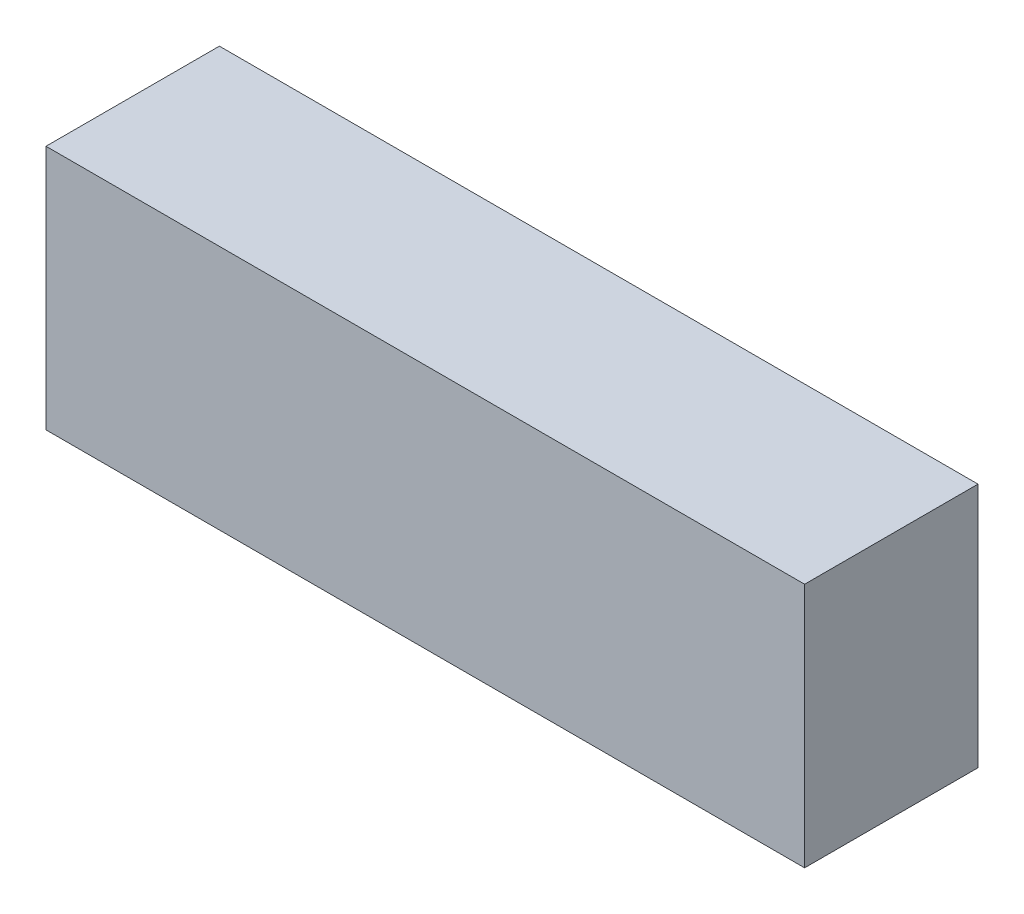
ISO-10303-21;
HEADER;
FILE_DESCRIPTION(('STEP AP214'),'2;1');
FILE_NAME('part.step','',(''),(''),'','','');
FILE_SCHEMA(('AUTOMOTIVE_DESIGN { 1 0 10303 214 1 1 1 1 }'));
ENDSEC;
DATA;
#1=APPLICATION_CONTEXT('core data for automotive mechanical design processes');
#2=APPLICATION_PROTOCOL_DEFINITION('international standard','automotive_design',2000,#1);
#3=PRODUCT_CONTEXT('',#1,'mechanical');
#4=PRODUCT('Part','Part','',(#3));
#5=PRODUCT_RELATED_PRODUCT_CATEGORY('part','',(#4));
#6=PRODUCT_DEFINITION_FORMATION('','',#4);
#7=PRODUCT_DEFINITION_CONTEXT('part definition',#1,'design');
#8=PRODUCT_DEFINITION('design','',#6,#7);
#9=PRODUCT_DEFINITION_SHAPE('','',#8);
#10=(LENGTH_UNIT() NAMED_UNIT(*) SI_UNIT(.MILLI.,.METRE.));
#11=(NAMED_UNIT(*) PLANE_ANGLE_UNIT() SI_UNIT($,.RADIAN.));
#12=(NAMED_UNIT(*) SI_UNIT($,.STERADIAN.) SOLID_ANGLE_UNIT());
#13=UNCERTAINTY_MEASURE_WITH_UNIT(LENGTH_MEASURE(1.E-05),#10,'distance_accuracy_value','');
#14=(GEOMETRIC_REPRESENTATION_CONTEXT(3) GLOBAL_UNCERTAINTY_ASSIGNED_CONTEXT((#13)) GLOBAL_UNIT_ASSIGNED_CONTEXT((#10,
#11,#12)) REPRESENTATION_CONTEXT('',''));
#15=CARTESIAN_POINT('',(0.,0.,0.));
#16=DIRECTION('',(0.,0.,1.));
#17=DIRECTION('',(1.,0.,0.));
#18=AXIS2_PLACEMENT_3D('',#15,#16,#17);
#19=CARTESIAN_POINT('',(-52.5,-17.,24.));
#20=DIRECTION('',(0.,0.,1.));
#21=DIRECTION('',(1.,0.,0.));
#22=AXIS2_PLACEMENT_3D('',#19,#20,#21);
#23=PLANE('',#22);
#24=DIRECTION('',(0.,1.,0.));
#25=VECTOR('',#24,1.);
#26=CARTESIAN_POINT('',(-52.5,-17.,24.));
#27=LINE('',#26,#25);
#28=CARTESIAN_POINT('',(-52.5,-17.,24.));
#29=VERTEX_POINT('',#28);
#30=CARTESIAN_POINT('',(-52.5,17.,24.));
#31=VERTEX_POINT('',#30);
#32=EDGE_CURVE('E86',#29,#31,#27,.T.);
#33=ORIENTED_EDGE('',*,*,#32,.F.);
#34=DIRECTION('',(1.,0.,0.));
#35=VECTOR('',#34,1.);
#36=CARTESIAN_POINT('',(-52.5,-17.,24.));
#37=LINE('',#36,#35);
#38=CARTESIAN_POINT('',(52.5,-17.,24.));
#39=VERTEX_POINT('',#38);
#40=EDGE_CURVE('E68',#29,#39,#37,.T.);
#41=ORIENTED_EDGE('',*,*,#40,.T.);
#42=DIRECTION('',(0.,1.,0.));
#43=VECTOR('',#42,1.);
#44=CARTESIAN_POINT('',(52.5,-17.,24.));
#45=LINE('',#44,#43);
#46=CARTESIAN_POINT('',(52.5,17.,24.));
#47=VERTEX_POINT('',#46);
#48=EDGE_CURVE('E80',#39,#47,#45,.T.);
#49=ORIENTED_EDGE('',*,*,#48,.T.);
#50=DIRECTION('',(1.,0.,0.));
#51=VECTOR('',#50,1.);
#52=CARTESIAN_POINT('',(-52.5,17.,24.));
#53=LINE('',#52,#51);
#54=EDGE_CURVE('E9',#31,#47,#53,.T.);
#55=ORIENTED_EDGE('',*,*,#54,.F.);
#56=EDGE_LOOP('',(#33,#41,#49,#55));
#57=FACE_BOUND('',#56,.T.);
#58=ADVANCED_FACE('F15',(#57),#23,.T.);
#59=CARTESIAN_POINT('',(-52.5,-17.,0.));
#60=DIRECTION('',(0.,0.,1.));
#61=DIRECTION('',(1.,0.,0.));
#62=AXIS2_PLACEMENT_3D('',#59,#60,#61);
#63=PLANE('',#62);
#64=DIRECTION('',(1.,0.,0.));
#65=VECTOR('',#64,1.);
#66=CARTESIAN_POINT('',(-52.5,17.,0.));
#67=LINE('',#66,#65);
#68=CARTESIAN_POINT('',(-52.5,17.,0.));
#69=VERTEX_POINT('',#68);
#70=CARTESIAN_POINT('',(52.5,17.,0.));
#71=VERTEX_POINT('',#70);
#72=EDGE_CURVE('E23',#69,#71,#67,.T.);
#73=ORIENTED_EDGE('',*,*,#72,.T.);
#74=DIRECTION('',(0.,1.,0.));
#75=VECTOR('',#74,1.);
#76=CARTESIAN_POINT('',(52.5,-17.,0.));
#77=LINE('',#76,#75);
#78=CARTESIAN_POINT('',(52.5,-17.,0.));
#79=VERTEX_POINT('',#78);
#80=EDGE_CURVE('E98',#79,#71,#77,.T.);
#81=ORIENTED_EDGE('',*,*,#80,.F.);
#82=DIRECTION('',(1.,0.,0.));
#83=VECTOR('',#82,1.);
#84=CARTESIAN_POINT('',(-52.5,-17.,0.));
#85=LINE('',#84,#83);
#86=CARTESIAN_POINT('',(-52.5,-17.,0.));
#87=VERTEX_POINT('',#86);
#88=EDGE_CURVE('E79',#87,#79,#85,.T.);
#89=ORIENTED_EDGE('',*,*,#88,.F.);
#90=DIRECTION('',(0.,1.,0.));
#91=VECTOR('',#90,1.);
#92=CARTESIAN_POINT('',(-52.5,-17.,0.));
#93=LINE('',#92,#91);
#94=EDGE_CURVE('E87',#87,#69,#93,.T.);
#95=ORIENTED_EDGE('',*,*,#94,.T.);
#96=EDGE_LOOP('',(#73,#81,#89,#95));
#97=FACE_BOUND('',#96,.T.);
#98=ADVANCED_FACE('F124',(#97),#63,.F.);
#99=CARTESIAN_POINT('',(-52.5,17.,0.));
#100=DIRECTION('',(0.,1.,0.));
#101=DIRECTION('',(1.,0.,0.));
#102=AXIS2_PLACEMENT_3D('',#99,#100,#101);
#103=PLANE('',#102);
#104=ORIENTED_EDGE('',*,*,#72,.F.);
#105=DIRECTION('',(0.,0.,1.));
#106=VECTOR('',#105,1.);
#107=CARTESIAN_POINT('',(-52.5,17.,0.));
#108=LINE('',#107,#106);
#109=EDGE_CURVE('E91',#69,#31,#108,.T.);
#110=ORIENTED_EDGE('',*,*,#109,.T.);
#111=ORIENTED_EDGE('',*,*,#54,.T.);
#112=DIRECTION('',(0.,0.,1.));
#113=VECTOR('',#112,1.);
#114=CARTESIAN_POINT('',(52.5,17.,0.));
#115=LINE('',#114,#113);
#116=EDGE_CURVE('E100',#71,#47,#115,.T.);
#117=ORIENTED_EDGE('',*,*,#116,.F.);
#118=EDGE_LOOP('',(#104,#110,#111,#117));
#119=FACE_BOUND('',#118,.T.);
#120=ADVANCED_FACE('F119',(#119),#103,.T.);
#121=CARTESIAN_POINT('',(-52.5,-17.,0.));
#122=DIRECTION('',(0.,1.,0.));
#123=DIRECTION('',(1.,0.,0.));
#124=AXIS2_PLACEMENT_3D('',#121,#122,#123);
#125=PLANE('',#124);
#126=DIRECTION('',(0.,0.,1.));
#127=VECTOR('',#126,1.);
#128=CARTESIAN_POINT('',(52.5,-17.,0.));
#129=LINE('',#128,#127);
#130=EDGE_CURVE('E74',#79,#39,#129,.T.);
#131=ORIENTED_EDGE('',*,*,#130,.T.);
#132=ORIENTED_EDGE('',*,*,#40,.F.);
#133=DIRECTION('',(0.,0.,1.));
#134=VECTOR('',#133,1.);
#135=CARTESIAN_POINT('',(-52.5,-17.,0.));
#136=LINE('',#135,#134);
#137=EDGE_CURVE('E71',#87,#29,#136,.T.);
#138=ORIENTED_EDGE('',*,*,#137,.F.);
#139=ORIENTED_EDGE('',*,*,#88,.T.);
#140=EDGE_LOOP('',(#131,#132,#138,#139));
#141=FACE_BOUND('',#140,.T.);
#142=ADVANCED_FACE('F70',(#141),#125,.F.);
#143=CARTESIAN_POINT('',(52.5,-17.,0.));
#144=DIRECTION('',(1.,0.,0.));
#145=DIRECTION('',(0.,1.,0.));
#146=AXIS2_PLACEMENT_3D('',#143,#144,#145);
#147=PLANE('',#146);
#148=ORIENTED_EDGE('',*,*,#130,.F.);
#149=ORIENTED_EDGE('',*,*,#80,.T.);
#150=ORIENTED_EDGE('',*,*,#116,.T.);
#151=ORIENTED_EDGE('',*,*,#48,.F.);
#152=EDGE_LOOP('',(#148,#149,#150,#151));
#153=FACE_BOUND('',#152,.T.);
#154=ADVANCED_FACE('F135',(#153),#147,.T.);
#155=CARTESIAN_POINT('',(-52.5,-17.,0.));
#156=DIRECTION('',(1.,0.,0.));
#157=DIRECTION('',(0.,1.,0.));
#158=AXIS2_PLACEMENT_3D('',#155,#156,#157);
#159=PLANE('',#158);
#160=ORIENTED_EDGE('',*,*,#32,.T.);
#161=ORIENTED_EDGE('',*,*,#109,.F.);
#162=ORIENTED_EDGE('',*,*,#94,.F.);
#163=ORIENTED_EDGE('',*,*,#137,.T.);
#164=EDGE_LOOP('',(#160,#161,#162,#163));
#165=FACE_BOUND('',#164,.T.);
#166=ADVANCED_FACE('F84',(#165),#159,.F.);
#167=CLOSED_SHELL('',(#58,#98,#120,#142,#154,#166));
#168=MANIFOLD_SOLID_BREP('B1',#167);
#169=ADVANCED_BREP_SHAPE_REPRESENTATION('',(#18,#168),#14);
#170=SHAPE_DEFINITION_REPRESENTATION(#9,#169);
ENDSEC;
END-ISO-10303-21;
